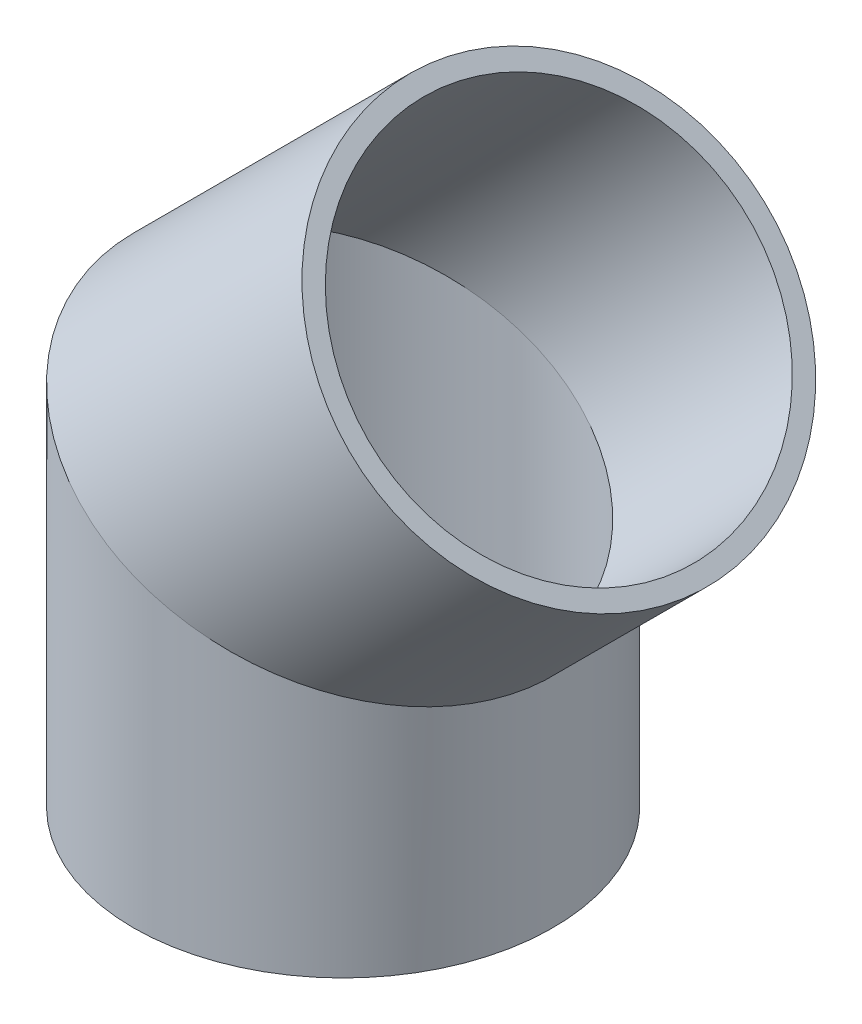
ISO-10303-21;
HEADER;
FILE_DESCRIPTION(('STEP AP214'),'2;1');
FILE_NAME('part.step','',(''),(''),'','','');
FILE_SCHEMA(('AUTOMOTIVE_DESIGN { 1 0 10303 214 1 1 1 1 }'));
ENDSEC;
DATA;
#1=APPLICATION_CONTEXT('core data for automotive mechanical design processes');
#2=APPLICATION_PROTOCOL_DEFINITION('international standard','automotive_design',2000,#1);
#3=PRODUCT_CONTEXT('',#1,'mechanical');
#4=PRODUCT('Part','Part','',(#3));
#5=PRODUCT_RELATED_PRODUCT_CATEGORY('part','',(#4));
#6=PRODUCT_DEFINITION_FORMATION('','',#4);
#7=PRODUCT_DEFINITION_CONTEXT('part definition',#1,'design');
#8=PRODUCT_DEFINITION('design','',#6,#7);
#9=PRODUCT_DEFINITION_SHAPE('','',#8);
#10=(LENGTH_UNIT() NAMED_UNIT(*) SI_UNIT(.MILLI.,.METRE.));
#11=(NAMED_UNIT(*) PLANE_ANGLE_UNIT() SI_UNIT($,.RADIAN.));
#12=(NAMED_UNIT(*) SI_UNIT($,.STERADIAN.) SOLID_ANGLE_UNIT());
#13=UNCERTAINTY_MEASURE_WITH_UNIT(LENGTH_MEASURE(1.E-05),#10,'distance_accuracy_value','');
#14=(GEOMETRIC_REPRESENTATION_CONTEXT(3) GLOBAL_UNCERTAINTY_ASSIGNED_CONTEXT((#13)) GLOBAL_UNIT_ASSIGNED_CONTEXT((#10,
#11,#12)) REPRESENTATION_CONTEXT('',''));
#15=CARTESIAN_POINT('',(0.,0.,0.));
#16=DIRECTION('',(0.,0.,1.));
#17=DIRECTION('',(1.,0.,0.));
#18=AXIS2_PLACEMENT_3D('',#15,#16,#17);
#19=CARTESIAN_POINT('',(-17.7907504163326,22.2092495836675,0.));
#20=DIRECTION('',(0.707106781186549,0.707106781186546,0.));
#21=DIRECTION('',(-0.707106781186546,0.707106781186549,0.));
#22=AXIS2_PLACEMENT_3D('',#19,#20,#21);
#23=CYLINDRICAL_SURFACE('',#22,27.5);
#24=CARTESIAN_POINT('',(0.,40.,0.));
#25=DIRECTION('',(0.382683432365091,0.923879532511287,0.));
#26=DIRECTION('',(-0.923879532511287,0.382683432365091,0.));
#27=AXIS2_PLACEMENT_3D('',#24,#25,#26);
#28=ELLIPSE('',#27,29.7657855080408,27.5);
#29=CARTESIAN_POINT('',(-27.5,51.3908729652601,0.));
#30=VERTEX_POINT('',#29);
#31=EDGE_CURVE('E40',#30,#30,#28,.F.);
#32=ORIENTED_EDGE('',*,*,#31,.F.);
#33=EDGE_LOOP('',(#32));
#34=FACE_BOUND('',#33,.T.);
#35=CARTESIAN_POINT('',(28.2842712474619,68.2842712474618,0.));
#36=DIRECTION('',(0.707106781186549,0.707106781186546,0.));
#37=DIRECTION('',(0.,0.,1.));
#38=AXIS2_PLACEMENT_3D('',#35,#36,#37);
#39=CIRCLE('',#38,27.5);
#40=CARTESIAN_POINT('',(28.2842712474619,68.2842712474618,27.5));
#41=VERTEX_POINT('',#40);
#42=EDGE_CURVE('E60',#41,#41,#39,.T.);
#43=ORIENTED_EDGE('',*,*,#42,.F.);
#44=EDGE_LOOP('',(#43));
#45=FACE_BOUND('',#44,.T.);
#46=ADVANCED_FACE('F37',(#34,#45),#23,.T.);
#47=CARTESIAN_POINT('',(0.,0.,0.));
#48=DIRECTION('',(0.,1.,0.));
#49=DIRECTION('',(0.,0.,1.));
#50=AXIS2_PLACEMENT_3D('',#47,#48,#49);
#51=CYLINDRICAL_SURFACE('',#50,27.5);
#52=CARTESIAN_POINT('',(0.,0.,0.));
#53=DIRECTION('',(0.,1.,0.));
#54=DIRECTION('',(0.,0.,1.));
#55=AXIS2_PLACEMENT_3D('',#52,#53,#54);
#56=CIRCLE('',#55,27.5);
#57=CARTESIAN_POINT('',(0.,0.,27.5));
#58=VERTEX_POINT('',#57);
#59=EDGE_CURVE('E57',#58,#58,#56,.T.);
#60=ORIENTED_EDGE('',*,*,#59,.T.);
#61=EDGE_LOOP('',(#60));
#62=FACE_BOUND('',#61,.T.);
#63=ORIENTED_EDGE('',*,*,#31,.T.);
#64=EDGE_LOOP('',(#63));
#65=FACE_BOUND('',#64,.T.);
#66=ADVANCED_FACE('F69',(#62,#65),#51,.T.);
#67=CARTESIAN_POINT('',(28.2842712474619,68.2842712474618,0.));
#68=DIRECTION('',(0.707106781186549,0.707106781186546,0.));
#69=DIRECTION('',(0.,0.,1.));
#70=AXIS2_PLACEMENT_3D('',#67,#68,#69);
#71=PLANE('',#70);
#72=CARTESIAN_POINT('',(28.2842712474619,68.2842712474618,0.));
#73=DIRECTION('',(0.707106781186549,0.707106781186546,0.));
#74=DIRECTION('',(0.,0.,1.));
#75=AXIS2_PLACEMENT_3D('',#72,#73,#74);
#76=CIRCLE('',#75,25.);
#77=CARTESIAN_POINT('',(28.2842712474619,68.2842712474618,25.));
#78=VERTEX_POINT('',#77);
#79=EDGE_CURVE('E51',#78,#78,#76,.F.);
#80=ORIENTED_EDGE('',*,*,#79,.T.);
#81=EDGE_LOOP('',(#80));
#82=FACE_BOUND('',#81,.T.);
#83=ORIENTED_EDGE('',*,*,#42,.T.);
#84=EDGE_LOOP('',(#83));
#85=FACE_BOUND('',#84,.T.);
#86=ADVANCED_FACE('F76',(#82,#85),#71,.T.);
#87=CARTESIAN_POINT('',(0.,0.,0.));
#88=DIRECTION('',(0.,1.,0.));
#89=DIRECTION('',(0.,0.,1.));
#90=AXIS2_PLACEMENT_3D('',#87,#88,#89);
#91=PLANE('',#90);
#92=CARTESIAN_POINT('',(0.,0.,0.));
#93=DIRECTION('',(0.,1.,0.));
#94=DIRECTION('',(0.,0.,1.));
#95=AXIS2_PLACEMENT_3D('',#92,#93,#94);
#96=CIRCLE('',#95,25.);
#97=CARTESIAN_POINT('',(0.,0.,25.));
#98=VERTEX_POINT('',#97);
#99=EDGE_CURVE('E45',#98,#98,#96,.F.);
#100=ORIENTED_EDGE('',*,*,#99,.F.);
#101=EDGE_LOOP('',(#100));
#102=FACE_BOUND('',#101,.T.);
#103=ORIENTED_EDGE('',*,*,#59,.F.);
#104=EDGE_LOOP('',(#103));
#105=FACE_BOUND('',#104,.T.);
#106=ADVANCED_FACE('F86',(#102,#105),#91,.F.);
#107=CARTESIAN_POINT('',(-16.1798377128586,23.8201622871415,0.));
#108=DIRECTION('',(0.707106781186549,0.707106781186546,0.));
#109=DIRECTION('',(-0.707106781186546,0.707106781186549,0.));
#110=AXIS2_PLACEMENT_3D('',#107,#108,#109);
#111=CYLINDRICAL_SURFACE('',#110,25.);
#112=CARTESIAN_POINT('',(0.,40.,0.));
#113=DIRECTION('',(0.38268343236509,0.923879532511286,0.));
#114=DIRECTION('',(-0.923879532511287,0.382683432365091,0.));
#115=AXIS2_PLACEMENT_3D('',#112,#113,#114);
#116=ELLIPSE('',#115,27.0598050073099,25.);
#117=CARTESIAN_POINT('',(-25.,50.3553390593274,0.));
#118=VERTEX_POINT('',#117);
#119=EDGE_CURVE('E10',#118,#118,#116,.T.);
#120=ORIENTED_EDGE('',*,*,#119,.F.);
#121=EDGE_LOOP('',(#120));
#122=FACE_BOUND('',#121,.T.);
#123=ORIENTED_EDGE('',*,*,#79,.F.);
#124=EDGE_LOOP('',(#123));
#125=FACE_BOUND('',#124,.T.);
#126=ADVANCED_FACE('F80',(#122,#125),#111,.F.);
#127=CARTESIAN_POINT('',(0.,0.,0.));
#128=DIRECTION('',(0.,1.,0.));
#129=DIRECTION('',(0.,0.,1.));
#130=AXIS2_PLACEMENT_3D('',#127,#128,#129);
#131=CYLINDRICAL_SURFACE('',#130,25.);
#132=ORIENTED_EDGE('',*,*,#99,.T.);
#133=EDGE_LOOP('',(#132));
#134=FACE_BOUND('',#133,.T.);
#135=ORIENTED_EDGE('',*,*,#119,.T.);
#136=EDGE_LOOP('',(#135));
#137=FACE_BOUND('',#136,.T.);
#138=ADVANCED_FACE('F78',(#134,#137),#131,.F.);
#139=CLOSED_SHELL('',(#46,#66,#86,#106,#126,#138));
#140=MANIFOLD_SOLID_BREP('B2',#139);
#141=ADVANCED_BREP_SHAPE_REPRESENTATION('',(#18,#140),#14);
#142=SHAPE_DEFINITION_REPRESENTATION(#9,#141);
ENDSEC;
END-ISO-10303-21;
